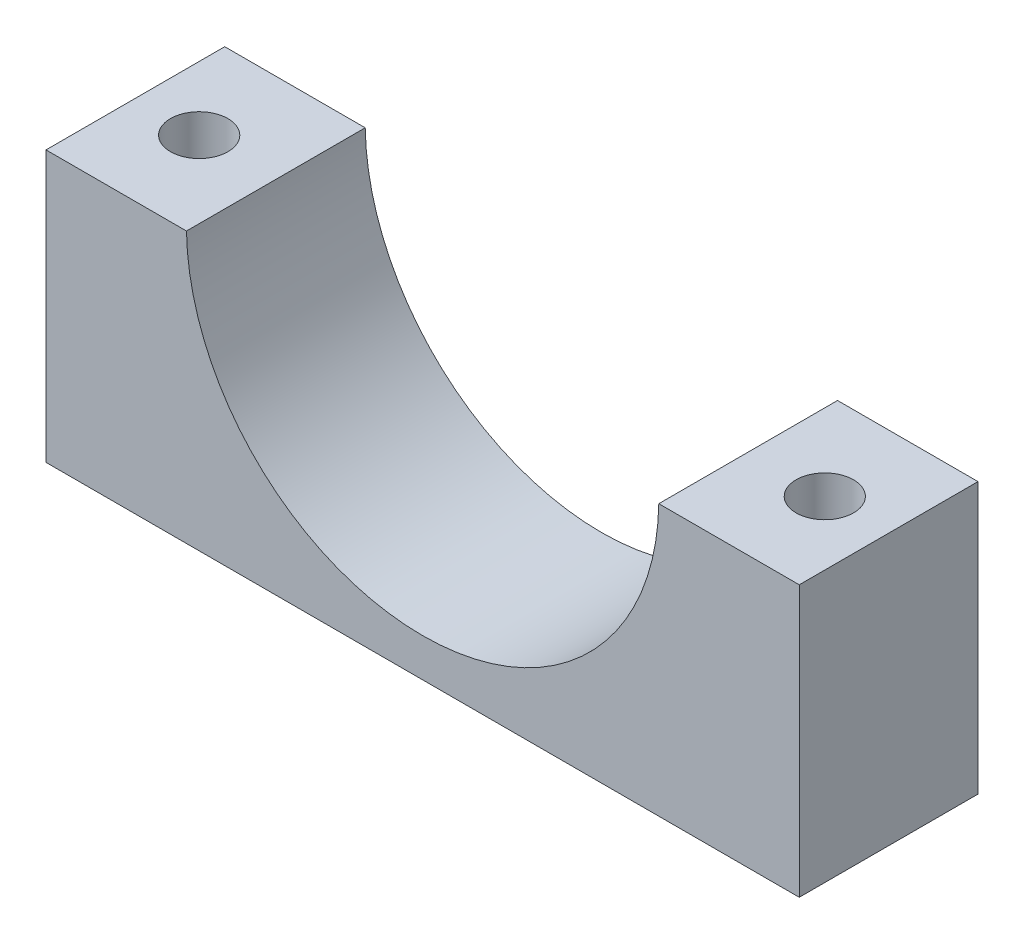
ISO-10303-21;
HEADER;
FILE_DESCRIPTION(('STEP AP214'),'2;1');
FILE_NAME('part.step','',(''),(''),'','','');
FILE_SCHEMA(('AUTOMOTIVE_DESIGN { 1 0 10303 214 1 1 1 1 }'));
ENDSEC;
DATA;
#1=APPLICATION_CONTEXT('core data for automotive mechanical design processes');
#2=APPLICATION_PROTOCOL_DEFINITION('international standard','automotive_design',2000,#1);
#3=PRODUCT_CONTEXT('',#1,'mechanical');
#4=PRODUCT('Part','Part','',(#3));
#5=PRODUCT_RELATED_PRODUCT_CATEGORY('part','',(#4));
#6=PRODUCT_DEFINITION_FORMATION('','',#4);
#7=PRODUCT_DEFINITION_CONTEXT('part definition',#1,'design');
#8=PRODUCT_DEFINITION('design','',#6,#7);
#9=PRODUCT_DEFINITION_SHAPE('','',#8);
#10=(LENGTH_UNIT() NAMED_UNIT(*) SI_UNIT(.MILLI.,.METRE.));
#11=(NAMED_UNIT(*) PLANE_ANGLE_UNIT() SI_UNIT($,.RADIAN.));
#12=(NAMED_UNIT(*) SI_UNIT($,.STERADIAN.) SOLID_ANGLE_UNIT());
#13=UNCERTAINTY_MEASURE_WITH_UNIT(LENGTH_MEASURE(1.E-05),#10,'distance_accuracy_value','');
#14=(GEOMETRIC_REPRESENTATION_CONTEXT(3) GLOBAL_UNCERTAINTY_ASSIGNED_CONTEXT((#13)) GLOBAL_UNIT_ASSIGNED_CONTEXT((#10,
#11,#12)) REPRESENTATION_CONTEXT('',''));
#15=CARTESIAN_POINT('',(0.,0.,0.));
#16=DIRECTION('',(0.,0.,1.));
#17=DIRECTION('',(1.,0.,0.));
#18=AXIS2_PLACEMENT_3D('',#15,#16,#17);
#19=CARTESIAN_POINT('',(-29.5,28.2,14.));
#20=DIRECTION('',(1.,0.,0.));
#21=DIRECTION('',(0.,0.,-1.));
#22=AXIS2_PLACEMENT_3D('',#19,#20,#21);
#23=PLANE('',#22);
#24=DIRECTION('',(0.,-1.,0.));
#25=VECTOR('',#24,1.);
#26=CARTESIAN_POINT('',(-29.5,28.2,0.));
#27=LINE('',#26,#25);
#28=CARTESIAN_POINT('',(-29.5,28.2,0.));
#29=VERTEX_POINT('',#28);
#30=CARTESIAN_POINT('',(-29.5,7.,0.));
#31=VERTEX_POINT('',#30);
#32=EDGE_CURVE('E136',#29,#31,#27,.T.);
#33=ORIENTED_EDGE('',*,*,#32,.T.);
#34=DIRECTION('',(0.,0.,-1.));
#35=VECTOR('',#34,1.);
#36=CARTESIAN_POINT('',(-29.5,7.,14.));
#37=LINE('',#36,#35);
#38=CARTESIAN_POINT('',(-29.5,7.,14.));
#39=VERTEX_POINT('',#38);
#40=EDGE_CURVE('E11',#39,#31,#37,.T.);
#41=ORIENTED_EDGE('',*,*,#40,.F.);
#42=DIRECTION('',(0.,-1.,0.));
#43=VECTOR('',#42,1.);
#44=CARTESIAN_POINT('',(-29.5,28.2,14.));
#45=LINE('',#44,#43);
#46=CARTESIAN_POINT('',(-29.5,28.2,14.));
#47=VERTEX_POINT('',#46);
#48=EDGE_CURVE('E152',#47,#39,#45,.T.);
#49=ORIENTED_EDGE('',*,*,#48,.F.);
#50=DIRECTION('',(0.,0.,-1.));
#51=VECTOR('',#50,1.);
#52=CARTESIAN_POINT('',(-29.5,28.2,14.));
#53=LINE('',#52,#51);
#54=EDGE_CURVE('E132',#47,#29,#53,.T.);
#55=ORIENTED_EDGE('',*,*,#54,.T.);
#56=EDGE_LOOP('',(#33,#41,#49,#55));
#57=FACE_BOUND('',#56,.T.);
#58=ADVANCED_FACE('F45',(#57),#23,.F.);
#59=CARTESIAN_POINT('',(-29.5,7.,14.));
#60=DIRECTION('',(0.,1.,0.));
#61=DIRECTION('',(0.,0.,1.));
#62=AXIS2_PLACEMENT_3D('',#59,#60,#61);
#63=PLANE('',#62);
#64=CARTESIAN_POINT('',(-24.5,7.,7.));
#65=DIRECTION('',(0.,1.,0.));
#66=DIRECTION('',(0.,0.,1.));
#67=AXIS2_PLACEMENT_3D('',#64,#65,#66);
#68=CIRCLE('',#67,2.25);
#69=CARTESIAN_POINT('',(-24.5,7.,9.25));
#70=VERTEX_POINT('',#69);
#71=EDGE_CURVE('E203',#70,#70,#68,.F.);
#72=ORIENTED_EDGE('',*,*,#71,.F.);
#73=EDGE_LOOP('',(#72));
#74=FACE_BOUND('',#73,.T.);
#75=CARTESIAN_POINT('',(24.5,7.,7.));
#76=DIRECTION('',(0.,1.,0.));
#77=DIRECTION('',(0.,0.,1.));
#78=AXIS2_PLACEMENT_3D('',#75,#76,#77);
#79=CIRCLE('',#78,2.25);
#80=CARTESIAN_POINT('',(24.5,7.,9.25));
#81=VERTEX_POINT('',#80);
#82=EDGE_CURVE('E141',#81,#81,#79,.F.);
#83=ORIENTED_EDGE('',*,*,#82,.F.);
#84=EDGE_LOOP('',(#83));
#85=FACE_BOUND('',#84,.T.);
#86=DIRECTION('',(1.,0.,0.));
#87=VECTOR('',#86,1.);
#88=CARTESIAN_POINT('',(-29.5,7.,0.));
#89=LINE('',#88,#87);
#90=CARTESIAN_POINT('',(29.5,7.,0.));
#91=VERTEX_POINT('',#90);
#92=EDGE_CURVE('E140',#31,#91,#89,.T.);
#93=ORIENTED_EDGE('',*,*,#92,.T.);
#94=DIRECTION('',(0.,0.,-1.));
#95=VECTOR('',#94,1.);
#96=CARTESIAN_POINT('',(29.5,7.,14.));
#97=LINE('',#96,#95);
#98=CARTESIAN_POINT('',(29.5,7.,14.));
#99=VERTEX_POINT('',#98);
#100=EDGE_CURVE('E54',#99,#91,#97,.T.);
#101=ORIENTED_EDGE('',*,*,#100,.F.);
#102=DIRECTION('',(1.,0.,0.));
#103=VECTOR('',#102,1.);
#104=CARTESIAN_POINT('',(-29.5,7.,14.));
#105=LINE('',#104,#103);
#106=EDGE_CURVE('E99',#39,#99,#105,.T.);
#107=ORIENTED_EDGE('',*,*,#106,.F.);
#108=ORIENTED_EDGE('',*,*,#40,.T.);
#109=EDGE_LOOP('',(#93,#101,#107,#108));
#110=FACE_BOUND('',#109,.T.);
#111=ADVANCED_FACE('F180',(#74,#85,#110),#63,.F.);
#112=CARTESIAN_POINT('',(29.5,7.,14.));
#113=DIRECTION('',(-1.,0.,0.));
#114=DIRECTION('',(0.,0.,1.));
#115=AXIS2_PLACEMENT_3D('',#112,#113,#114);
#116=PLANE('',#115);
#117=DIRECTION('',(0.,1.,0.));
#118=VECTOR('',#117,1.);
#119=CARTESIAN_POINT('',(29.5,7.,0.));
#120=LINE('',#119,#118);
#121=CARTESIAN_POINT('',(29.5,28.2,0.));
#122=VERTEX_POINT('',#121);
#123=EDGE_CURVE('E143',#91,#122,#120,.T.);
#124=ORIENTED_EDGE('',*,*,#123,.T.);
#125=DIRECTION('',(0.,0.,-1.));
#126=VECTOR('',#125,1.);
#127=CARTESIAN_POINT('',(29.5,28.2,14.));
#128=LINE('',#127,#126);
#129=CARTESIAN_POINT('',(29.5,28.2,14.));
#130=VERTEX_POINT('',#129);
#131=EDGE_CURVE('E123',#130,#122,#128,.T.);
#132=ORIENTED_EDGE('',*,*,#131,.F.);
#133=DIRECTION('',(0.,1.,0.));
#134=VECTOR('',#133,1.);
#135=CARTESIAN_POINT('',(29.5,7.,14.));
#136=LINE('',#135,#134);
#137=EDGE_CURVE('E112',#99,#130,#136,.T.);
#138=ORIENTED_EDGE('',*,*,#137,.F.);
#139=ORIENTED_EDGE('',*,*,#100,.T.);
#140=EDGE_LOOP('',(#124,#132,#138,#139));
#141=FACE_BOUND('',#140,.T.);
#142=ADVANCED_FACE('F161',(#141),#116,.F.);
#143=CARTESIAN_POINT('',(29.5,28.2,14.));
#144=DIRECTION('',(0.,-1.,0.));
#145=DIRECTION('',(0.,0.,-1.));
#146=AXIS2_PLACEMENT_3D('',#143,#144,#145);
#147=PLANE('',#146);
#148=CARTESIAN_POINT('',(24.5,28.2,7.));
#149=DIRECTION('',(0.,1.,0.));
#150=DIRECTION('',(0.,0.,1.));
#151=AXIS2_PLACEMENT_3D('',#148,#149,#150);
#152=CIRCLE('',#151,2.25);
#153=CARTESIAN_POINT('',(24.5,28.2,9.25));
#154=VERTEX_POINT('',#153);
#155=EDGE_CURVE('E195',#154,#154,#152,.T.);
#156=ORIENTED_EDGE('',*,*,#155,.F.);
#157=EDGE_LOOP('',(#156));
#158=FACE_BOUND('',#157,.T.);
#159=DIRECTION('',(-1.,0.,0.));
#160=VECTOR('',#159,1.);
#161=CARTESIAN_POINT('',(29.5,28.2,0.));
#162=LINE('',#161,#160);
#163=CARTESIAN_POINT('',(18.497567408,28.2,0.));
#164=VERTEX_POINT('',#163);
#165=EDGE_CURVE('E121',#122,#164,#162,.T.);
#166=ORIENTED_EDGE('',*,*,#165,.T.);
#167=DIRECTION('',(0.,0.,-1.));
#168=VECTOR('',#167,1.);
#169=CARTESIAN_POINT('',(18.497567408,28.2,14.));
#170=LINE('',#169,#168);
#171=CARTESIAN_POINT('',(18.497567408,28.2,14.));
#172=VERTEX_POINT('',#171);
#173=EDGE_CURVE('E118',#172,#164,#170,.T.);
#174=ORIENTED_EDGE('',*,*,#173,.F.);
#175=DIRECTION('',(-1.,0.,0.));
#176=VECTOR('',#175,1.);
#177=CARTESIAN_POINT('',(29.5,28.2,14.));
#178=LINE('',#177,#176);
#179=EDGE_CURVE('E106',#130,#172,#178,.T.);
#180=ORIENTED_EDGE('',*,*,#179,.F.);
#181=ORIENTED_EDGE('',*,*,#131,.T.);
#182=EDGE_LOOP('',(#166,#174,#180,#181));
#183=FACE_BOUND('',#182,.T.);
#184=ADVANCED_FACE('F119',(#158,#183),#147,.F.);
#185=CARTESIAN_POINT('',(0.,28.500000000371,14.));
#186=DIRECTION('',(0.,0.,-1.));
#187=DIRECTION('',(-1.,0.,0.));
#188=AXIS2_PLACEMENT_3D('',#185,#186,#187);
#189=CYLINDRICAL_SURFACE('',#188,18.500000000371);
#190=CARTESIAN_POINT('',(0.,28.500000000371,0.));
#191=DIRECTION('',(0.,0.,-1.));
#192=DIRECTION('',(-1.,0.,0.));
#193=AXIS2_PLACEMENT_3D('',#190,#191,#192);
#194=CIRCLE('',#193,18.500000000371);
#195=CARTESIAN_POINT('',(-18.497567408,28.2,0.));
#196=VERTEX_POINT('',#195);
#197=EDGE_CURVE('E85',#164,#196,#194,.T.);
#198=ORIENTED_EDGE('',*,*,#197,.T.);
#199=DIRECTION('',(0.,0.,-1.));
#200=VECTOR('',#199,1.);
#201=CARTESIAN_POINT('',(-18.497567408,28.2,14.));
#202=LINE('',#201,#200);
#203=CARTESIAN_POINT('',(-18.497567408,28.2,14.));
#204=VERTEX_POINT('',#203);
#205=EDGE_CURVE('E124',#204,#196,#202,.T.);
#206=ORIENTED_EDGE('',*,*,#205,.F.);
#207=CARTESIAN_POINT('',(0.,28.500000000371,14.));
#208=DIRECTION('',(0.,0.,-1.));
#209=DIRECTION('',(-1.,0.,0.));
#210=AXIS2_PLACEMENT_3D('',#207,#208,#209);
#211=CIRCLE('',#210,18.500000000371);
#212=EDGE_CURVE('E110',#172,#204,#211,.T.);
#213=ORIENTED_EDGE('',*,*,#212,.F.);
#214=ORIENTED_EDGE('',*,*,#173,.T.);
#215=EDGE_LOOP('',(#198,#206,#213,#214));
#216=FACE_BOUND('',#215,.T.);
#217=ADVANCED_FACE('F126',(#216),#189,.F.);
#218=CARTESIAN_POINT('',(-18.497567408,28.2,14.));
#219=DIRECTION('',(0.,-1.,0.));
#220=DIRECTION('',(0.,0.,-1.));
#221=AXIS2_PLACEMENT_3D('',#218,#219,#220);
#222=PLANE('',#221);
#223=CARTESIAN_POINT('',(-24.5,28.2,7.));
#224=DIRECTION('',(0.,1.,0.));
#225=DIRECTION('',(0.,0.,1.));
#226=AXIS2_PLACEMENT_3D('',#223,#224,#225);
#227=CIRCLE('',#226,2.25);
#228=CARTESIAN_POINT('',(-24.5,28.2,9.25));
#229=VERTEX_POINT('',#228);
#230=EDGE_CURVE('E198',#229,#229,#227,.T.);
#231=ORIENTED_EDGE('',*,*,#230,.F.);
#232=EDGE_LOOP('',(#231));
#233=FACE_BOUND('',#232,.T.);
#234=DIRECTION('',(-1.,0.,0.));
#235=VECTOR('',#234,1.);
#236=CARTESIAN_POINT('',(-18.497567408,28.2,0.));
#237=LINE('',#236,#235);
#238=EDGE_CURVE('E91',#196,#29,#237,.T.);
#239=ORIENTED_EDGE('',*,*,#238,.T.);
#240=ORIENTED_EDGE('',*,*,#54,.F.);
#241=DIRECTION('',(-1.,0.,0.));
#242=VECTOR('',#241,1.);
#243=CARTESIAN_POINT('',(-18.497567408,28.2,14.));
#244=LINE('',#243,#242);
#245=EDGE_CURVE('E62',#204,#47,#244,.T.);
#246=ORIENTED_EDGE('',*,*,#245,.F.);
#247=ORIENTED_EDGE('',*,*,#205,.T.);
#248=EDGE_LOOP('',(#239,#240,#246,#247));
#249=FACE_BOUND('',#248,.T.);
#250=ADVANCED_FACE('F168',(#233,#249),#222,.F.);
#251=CARTESIAN_POINT('',(0.,28.500000000371,14.));
#252=DIRECTION('',(0.,0.,-1.));
#253=DIRECTION('',(-1.,0.,0.));
#254=AXIS2_PLACEMENT_3D('',#251,#252,#253);
#255=PLANE('',#254);
#256=ORIENTED_EDGE('',*,*,#48,.T.);
#257=ORIENTED_EDGE('',*,*,#106,.T.);
#258=ORIENTED_EDGE('',*,*,#137,.T.);
#259=ORIENTED_EDGE('',*,*,#179,.T.);
#260=ORIENTED_EDGE('',*,*,#212,.T.);
#261=ORIENTED_EDGE('',*,*,#245,.T.);
#262=EDGE_LOOP('',(#256,#257,#258,#259,#260,#261));
#263=FACE_BOUND('',#262,.T.);
#264=ADVANCED_FACE('F108',(#263),#255,.F.);
#265=CARTESIAN_POINT('',(0.,28.500000000371,0.));
#266=DIRECTION('',(0.,0.,-1.));
#267=DIRECTION('',(-1.,0.,0.));
#268=AXIS2_PLACEMENT_3D('',#265,#266,#267);
#269=PLANE('',#268);
#270=ORIENTED_EDGE('',*,*,#32,.F.);
#271=ORIENTED_EDGE('',*,*,#238,.F.);
#272=ORIENTED_EDGE('',*,*,#197,.F.);
#273=ORIENTED_EDGE('',*,*,#165,.F.);
#274=ORIENTED_EDGE('',*,*,#123,.F.);
#275=ORIENTED_EDGE('',*,*,#92,.F.);
#276=EDGE_LOOP('',(#270,#271,#272,#273,#274,#275));
#277=FACE_BOUND('',#276,.T.);
#278=ADVANCED_FACE('F164',(#277),#269,.T.);
#279=CARTESIAN_POINT('',(-24.5,7.,7.));
#280=DIRECTION('',(0.,-1.,0.));
#281=DIRECTION('',(0.,0.,-1.));
#282=AXIS2_PLACEMENT_3D('',#279,#280,#281);
#283=CYLINDRICAL_SURFACE('',#282,2.25);
#284=ORIENTED_EDGE('',*,*,#230,.T.);
#285=EDGE_LOOP('',(#284));
#286=FACE_BOUND('',#285,.T.);
#287=ORIENTED_EDGE('',*,*,#71,.T.);
#288=EDGE_LOOP('',(#287));
#289=FACE_BOUND('',#288,.T.);
#290=ADVANCED_FACE('F219',(#286,#289),#283,.F.);
#291=CARTESIAN_POINT('',(24.5,7.,7.));
#292=DIRECTION('',(0.,-1.,0.));
#293=DIRECTION('',(0.,0.,-1.));
#294=AXIS2_PLACEMENT_3D('',#291,#292,#293);
#295=CYLINDRICAL_SURFACE('',#294,2.25);
#296=ORIENTED_EDGE('',*,*,#155,.T.);
#297=EDGE_LOOP('',(#296));
#298=FACE_BOUND('',#297,.T.);
#299=ORIENTED_EDGE('',*,*,#82,.T.);
#300=EDGE_LOOP('',(#299));
#301=FACE_BOUND('',#300,.T.);
#302=ADVANCED_FACE('F217',(#298,#301),#295,.F.);
#303=CLOSED_SHELL('',(#58,#111,#142,#184,#217,#250,#264,#278,#290,#302));
#304=MANIFOLD_SOLID_BREP('B2',#303);
#305=ADVANCED_BREP_SHAPE_REPRESENTATION('',(#18,#304),#14);
#306=SHAPE_DEFINITION_REPRESENTATION(#9,#305);
ENDSEC;
END-ISO-10303-21;
